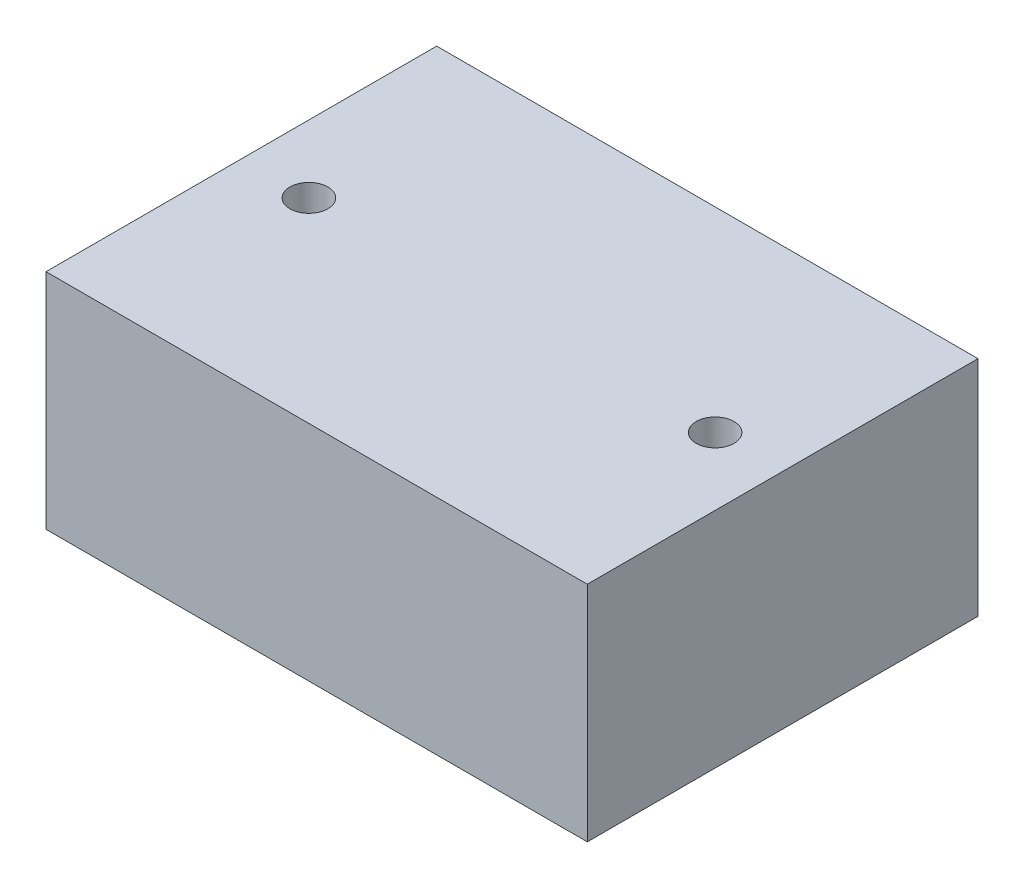
ISO-10303-21;
HEADER;
FILE_DESCRIPTION(('STEP AP214'),'2;1');
FILE_NAME('part.step','',(''),(''),'','','');
FILE_SCHEMA(('AUTOMOTIVE_DESIGN { 1 0 10303 214 1 1 1 1 }'));
ENDSEC;
DATA;
#1=APPLICATION_CONTEXT('core data for automotive mechanical design processes');
#2=APPLICATION_PROTOCOL_DEFINITION('international standard','automotive_design',2000,#1);
#3=PRODUCT_CONTEXT('',#1,'mechanical');
#4=PRODUCT('Part','Part','',(#3));
#5=PRODUCT_RELATED_PRODUCT_CATEGORY('part','',(#4));
#6=PRODUCT_DEFINITION_FORMATION('','',#4);
#7=PRODUCT_DEFINITION_CONTEXT('part definition',#1,'design');
#8=PRODUCT_DEFINITION('design','',#6,#7);
#9=PRODUCT_DEFINITION_SHAPE('','',#8);
#10=(LENGTH_UNIT() NAMED_UNIT(*) SI_UNIT(.MILLI.,.METRE.));
#11=(NAMED_UNIT(*) PLANE_ANGLE_UNIT() SI_UNIT($,.RADIAN.));
#12=(NAMED_UNIT(*) SI_UNIT($,.STERADIAN.) SOLID_ANGLE_UNIT());
#13=UNCERTAINTY_MEASURE_WITH_UNIT(LENGTH_MEASURE(1.E-05),#10,'distance_accuracy_value','');
#14=(GEOMETRIC_REPRESENTATION_CONTEXT(3) GLOBAL_UNCERTAINTY_ASSIGNED_CONTEXT((#13)) GLOBAL_UNIT_ASSIGNED_CONTEXT((#10,
#11,#12)) REPRESENTATION_CONTEXT('',''));
#15=CARTESIAN_POINT('',(0.,0.,0.));
#16=DIRECTION('',(0.,0.,1.));
#17=DIRECTION('',(1.,0.,0.));
#18=AXIS2_PLACEMENT_3D('',#15,#16,#17);
#19=CARTESIAN_POINT('',(31.425,25.91,22.68));
#20=DIRECTION('',(-1.,0.,0.));
#21=DIRECTION('',(0.,0.,1.));
#22=AXIS2_PLACEMENT_3D('',#19,#20,#21);
#23=PLANE('',#22);
#24=DIRECTION('',(0.,0.,-1.));
#25=VECTOR('',#24,1.);
#26=CARTESIAN_POINT('',(31.425,0.,22.68));
#27=LINE('',#26,#25);
#28=CARTESIAN_POINT('',(31.425,0.,22.68));
#29=VERTEX_POINT('',#28);
#30=CARTESIAN_POINT('',(31.425,0.,-22.68));
#31=VERTEX_POINT('',#30);
#32=EDGE_CURVE('E95',#29,#31,#27,.T.);
#33=ORIENTED_EDGE('',*,*,#32,.T.);
#34=DIRECTION('',(0.,-1.,0.));
#35=VECTOR('',#34,1.);
#36=CARTESIAN_POINT('',(31.425,25.91,-22.68));
#37=LINE('',#36,#35);
#38=CARTESIAN_POINT('',(31.425,25.91,-22.68));
#39=VERTEX_POINT('',#38);
#40=EDGE_CURVE('E11',#39,#31,#37,.T.);
#41=ORIENTED_EDGE('',*,*,#40,.F.);
#42=DIRECTION('',(0.,0.,-1.));
#43=VECTOR('',#42,1.);
#44=CARTESIAN_POINT('',(31.425,25.91,22.68));
#45=LINE('',#44,#43);
#46=CARTESIAN_POINT('',(31.425,25.91,22.68));
#47=VERTEX_POINT('',#46);
#48=EDGE_CURVE('E83',#47,#39,#45,.T.);
#49=ORIENTED_EDGE('',*,*,#48,.F.);
#50=DIRECTION('',(0.,-1.,0.));
#51=VECTOR('',#50,1.);
#52=CARTESIAN_POINT('',(31.425,25.91,22.68));
#53=LINE('',#52,#51);
#54=EDGE_CURVE('E91',#47,#29,#53,.T.);
#55=ORIENTED_EDGE('',*,*,#54,.T.);
#56=EDGE_LOOP('',(#33,#41,#49,#55));
#57=FACE_BOUND('',#56,.T.);
#58=ADVANCED_FACE('F32',(#57),#23,.F.);
#59=CARTESIAN_POINT('',(-31.425,25.91,-22.68));
#60=DIRECTION('',(0.,0.,1.));
#61=DIRECTION('',(1.,0.,0.));
#62=AXIS2_PLACEMENT_3D('',#59,#60,#61);
#63=PLANE('',#62);
#64=DIRECTION('',(-1.,0.,0.));
#65=VECTOR('',#64,1.);
#66=CARTESIAN_POINT('',(-31.425,0.,-22.68));
#67=LINE('',#66,#65);
#68=CARTESIAN_POINT('',(-31.425,0.,-22.68));
#69=VERTEX_POINT('',#68);
#70=EDGE_CURVE('E87',#31,#69,#67,.T.);
#71=ORIENTED_EDGE('',*,*,#70,.T.);
#72=DIRECTION('',(0.,-1.,0.));
#73=VECTOR('',#72,1.);
#74=CARTESIAN_POINT('',(-31.425,25.91,-22.68));
#75=LINE('',#74,#73);
#76=CARTESIAN_POINT('',(-31.425,25.91,-22.68));
#77=VERTEX_POINT('',#76);
#78=EDGE_CURVE('E40',#77,#69,#75,.T.);
#79=ORIENTED_EDGE('',*,*,#78,.F.);
#80=DIRECTION('',(-1.,0.,0.));
#81=VECTOR('',#80,1.);
#82=CARTESIAN_POINT('',(-31.425,25.91,-22.68));
#83=LINE('',#82,#81);
#84=EDGE_CURVE('E78',#39,#77,#83,.T.);
#85=ORIENTED_EDGE('',*,*,#84,.F.);
#86=ORIENTED_EDGE('',*,*,#40,.T.);
#87=EDGE_LOOP('',(#71,#79,#85,#86));
#88=FACE_BOUND('',#87,.T.);
#89=ADVANCED_FACE('F86',(#88),#63,.F.);
#90=CARTESIAN_POINT('',(-31.425,25.91,22.68));
#91=DIRECTION('',(1.,0.,0.));
#92=DIRECTION('',(0.,0.,-1.));
#93=AXIS2_PLACEMENT_3D('',#90,#91,#92);
#94=PLANE('',#93);
#95=DIRECTION('',(0.,0.,1.));
#96=VECTOR('',#95,1.);
#97=CARTESIAN_POINT('',(-31.425,0.,22.68));
#98=LINE('',#97,#96);
#99=CARTESIAN_POINT('',(-31.425,0.,22.68));
#100=VERTEX_POINT('',#99);
#101=EDGE_CURVE('E65',#69,#100,#98,.T.);
#102=ORIENTED_EDGE('',*,*,#101,.T.);
#103=DIRECTION('',(0.,-1.,0.));
#104=VECTOR('',#103,1.);
#105=CARTESIAN_POINT('',(-31.425,25.91,22.68));
#106=LINE('',#105,#104);
#107=CARTESIAN_POINT('',(-31.425,25.91,22.68));
#108=VERTEX_POINT('',#107);
#109=EDGE_CURVE('E88',#108,#100,#106,.T.);
#110=ORIENTED_EDGE('',*,*,#109,.F.);
#111=DIRECTION('',(0.,0.,1.));
#112=VECTOR('',#111,1.);
#113=CARTESIAN_POINT('',(-31.425,25.91,22.68));
#114=LINE('',#113,#112);
#115=EDGE_CURVE('E81',#77,#108,#114,.T.);
#116=ORIENTED_EDGE('',*,*,#115,.F.);
#117=ORIENTED_EDGE('',*,*,#78,.T.);
#118=EDGE_LOOP('',(#102,#110,#116,#117));
#119=FACE_BOUND('',#118,.T.);
#120=ADVANCED_FACE('F89',(#119),#94,.F.);
#121=CARTESIAN_POINT('',(-31.425,25.91,22.68));
#122=DIRECTION('',(0.,0.,-1.));
#123=DIRECTION('',(-1.,0.,0.));
#124=AXIS2_PLACEMENT_3D('',#121,#122,#123);
#125=PLANE('',#124);
#126=DIRECTION('',(1.,0.,0.));
#127=VECTOR('',#126,1.);
#128=CARTESIAN_POINT('',(-31.425,0.,22.68));
#129=LINE('',#128,#127);
#130=EDGE_CURVE('E71',#100,#29,#129,.T.);
#131=ORIENTED_EDGE('',*,*,#130,.T.);
#132=ORIENTED_EDGE('',*,*,#54,.F.);
#133=DIRECTION('',(1.,0.,0.));
#134=VECTOR('',#133,1.);
#135=CARTESIAN_POINT('',(-31.425,25.91,22.68));
#136=LINE('',#135,#134);
#137=EDGE_CURVE('E48',#108,#47,#136,.T.);
#138=ORIENTED_EDGE('',*,*,#137,.F.);
#139=ORIENTED_EDGE('',*,*,#109,.T.);
#140=EDGE_LOOP('',(#131,#132,#138,#139));
#141=FACE_BOUND('',#140,.T.);
#142=ADVANCED_FACE('F103',(#141),#125,.F.);
#143=CARTESIAN_POINT('',(0.,25.91,0.));
#144=DIRECTION('',(0.,-1.,0.));
#145=DIRECTION('',(0.,0.,-1.));
#146=AXIS2_PLACEMENT_3D('',#143,#144,#145);
#147=PLANE('',#146);
#148=CARTESIAN_POINT('',(-23.585,25.91,0.));
#149=DIRECTION('',(0.,1.,0.));
#150=DIRECTION('',(0.,0.,-1.));
#151=AXIS2_PLACEMENT_3D('',#148,#149,#150);
#152=CIRCLE('',#151,2.2);
#153=CARTESIAN_POINT('',(-23.585,25.91,-2.2));
#154=VERTEX_POINT('',#153);
#155=EDGE_CURVE('E112',#154,#154,#152,.T.);
#156=ORIENTED_EDGE('',*,*,#155,.F.);
#157=EDGE_LOOP('',(#156));
#158=FACE_BOUND('',#157,.T.);
#159=CARTESIAN_POINT('',(23.585,25.91,0.));
#160=DIRECTION('',(0.,-1.,0.));
#161=DIRECTION('',(0.,0.,-1.));
#162=AXIS2_PLACEMENT_3D('',#159,#160,#161);
#163=CIRCLE('',#162,2.2);
#164=CARTESIAN_POINT('',(23.585,25.91,-2.2));
#165=VERTEX_POINT('',#164);
#166=EDGE_CURVE('E98',#165,#165,#163,.T.);
#167=ORIENTED_EDGE('',*,*,#166,.T.);
#168=EDGE_LOOP('',(#167));
#169=FACE_BOUND('',#168,.T.);
#170=ORIENTED_EDGE('',*,*,#48,.T.);
#171=ORIENTED_EDGE('',*,*,#84,.T.);
#172=ORIENTED_EDGE('',*,*,#115,.T.);
#173=ORIENTED_EDGE('',*,*,#137,.T.);
#174=EDGE_LOOP('',(#170,#171,#172,#173));
#175=FACE_BOUND('',#174,.T.);
#176=ADVANCED_FACE('F79',(#158,#169,#175),#147,.F.);
#177=CARTESIAN_POINT('',(0.,0.,0.));
#178=DIRECTION('',(0.,-1.,0.));
#179=DIRECTION('',(0.,0.,-1.));
#180=AXIS2_PLACEMENT_3D('',#177,#178,#179);
#181=PLANE('',#180);
#182=CARTESIAN_POINT('',(-23.585,0.,0.));
#183=DIRECTION('',(0.,1.,0.));
#184=DIRECTION('',(0.,0.,-1.));
#185=AXIS2_PLACEMENT_3D('',#182,#183,#184);
#186=CIRCLE('',#185,2.2);
#187=CARTESIAN_POINT('',(-23.585,0.,-2.2));
#188=VERTEX_POINT('',#187);
#189=EDGE_CURVE('E115',#188,#188,#186,.T.);
#190=ORIENTED_EDGE('',*,*,#189,.T.);
#191=EDGE_LOOP('',(#190));
#192=FACE_BOUND('',#191,.T.);
#193=CARTESIAN_POINT('',(23.585,0.,0.));
#194=DIRECTION('',(0.,-1.,0.));
#195=DIRECTION('',(0.,0.,-1.));
#196=AXIS2_PLACEMENT_3D('',#193,#194,#195);
#197=CIRCLE('',#196,2.2);
#198=CARTESIAN_POINT('',(23.585,0.,-2.2));
#199=VERTEX_POINT('',#198);
#200=EDGE_CURVE('E109',#199,#199,#197,.T.);
#201=ORIENTED_EDGE('',*,*,#200,.F.);
#202=EDGE_LOOP('',(#201));
#203=FACE_BOUND('',#202,.T.);
#204=ORIENTED_EDGE('',*,*,#32,.F.);
#205=ORIENTED_EDGE('',*,*,#130,.F.);
#206=ORIENTED_EDGE('',*,*,#101,.F.);
#207=ORIENTED_EDGE('',*,*,#70,.F.);
#208=EDGE_LOOP('',(#204,#205,#206,#207));
#209=FACE_BOUND('',#208,.T.);
#210=ADVANCED_FACE('F106',(#192,#203,#209),#181,.T.);
#211=CARTESIAN_POINT('',(23.585,25.91,0.));
#212=DIRECTION('',(0.,-1.,0.));
#213=DIRECTION('',(0.,0.,-1.));
#214=AXIS2_PLACEMENT_3D('',#211,#212,#213);
#215=CYLINDRICAL_SURFACE('',#214,2.2);
#216=CARTESIAN_POINT('',(23.585,25.91,-2.2));
#217=CARTESIAN_POINT('',(23.585,25.6401041666667,-2.2));
#218=CARTESIAN_POINT('',(23.585,25.3702083333333,-2.2));
#219=CARTESIAN_POINT('',(23.585,24.8304166666667,-2.2));
#220=CARTESIAN_POINT('',(23.585,24.5605208333333,-2.2));
#221=CARTESIAN_POINT('',(23.585,24.0207291666667,-2.2));
#222=CARTESIAN_POINT('',(23.585,23.7508333333333,-2.2));
#223=CARTESIAN_POINT('',(23.585,23.2110416666667,-2.2));
#224=CARTESIAN_POINT('',(23.585,22.9411458333333,-2.2));
#225=CARTESIAN_POINT('',(23.585,22.4013541666667,-2.2));
#226=CARTESIAN_POINT('',(23.585,22.1314583333333,-2.2));
#227=CARTESIAN_POINT('',(23.585,21.5916666666667,-2.2));
#228=CARTESIAN_POINT('',(23.585,21.3217708333333,-2.2));
#229=CARTESIAN_POINT('',(23.585,20.7819791666667,-2.2));
#230=CARTESIAN_POINT('',(23.585,20.5120833333333,-2.2));
#231=CARTESIAN_POINT('',(23.585,19.9722916666667,-2.2));
#232=CARTESIAN_POINT('',(23.585,19.7023958333333,-2.2));
#233=CARTESIAN_POINT('',(23.585,19.1626041666667,-2.2));
#234=CARTESIAN_POINT('',(23.585,18.8927083333333,-2.2));
#235=CARTESIAN_POINT('',(23.585,18.3529166666667,-2.2));
#236=CARTESIAN_POINT('',(23.585,18.0830208333333,-2.2));
#237=CARTESIAN_POINT('',(23.585,17.5432291666667,-2.2));
#238=CARTESIAN_POINT('',(23.585,17.2733333333333,-2.2));
#239=CARTESIAN_POINT('',(23.585,16.7335416666667,-2.2));
#240=CARTESIAN_POINT('',(23.585,16.4636458333333,-2.2));
#241=CARTESIAN_POINT('',(23.585,15.9238541666667,-2.2));
#242=CARTESIAN_POINT('',(23.585,15.6539583333333,-2.2));
#243=CARTESIAN_POINT('',(23.585,15.1141666666667,-2.2));
#244=CARTESIAN_POINT('',(23.585,14.8442708333333,-2.2));
#245=CARTESIAN_POINT('',(23.585,14.3044791666667,-2.2));
#246=CARTESIAN_POINT('',(23.585,14.0345833333333,-2.2));
#247=CARTESIAN_POINT('',(23.585,13.4947916666667,-2.2));
#248=CARTESIAN_POINT('',(23.585,13.2248958333333,-2.2));
#249=CARTESIAN_POINT('',(23.585,12.6851041666667,-2.2));
#250=CARTESIAN_POINT('',(23.585,12.4152083333333,-2.2));
#251=CARTESIAN_POINT('',(23.585,11.8754166666667,-2.2));
#252=CARTESIAN_POINT('',(23.585,11.6055208333333,-2.2));
#253=CARTESIAN_POINT('',(23.585,11.0657291666667,-2.2));
#254=CARTESIAN_POINT('',(23.585,10.7958333333333,-2.2));
#255=CARTESIAN_POINT('',(23.585,10.2560416666667,-2.2));
#256=CARTESIAN_POINT('',(23.585,9.98614583333334,-2.2));
#257=CARTESIAN_POINT('',(23.585,9.44635416666667,-2.2));
#258=CARTESIAN_POINT('',(23.585,9.17645833333333,-2.2));
#259=CARTESIAN_POINT('',(23.585,8.63666666666666,-2.2));
#260=CARTESIAN_POINT('',(23.585,8.36677083333333,-2.2));
#261=CARTESIAN_POINT('',(23.585,7.82697916666667,-2.2));
#262=CARTESIAN_POINT('',(23.585,7.55708333333333,-2.2));
#263=CARTESIAN_POINT('',(23.585,7.01729166666667,-2.2));
#264=CARTESIAN_POINT('',(23.585,6.74739583333333,-2.2));
#265=CARTESIAN_POINT('',(23.585,6.20760416666667,-2.2));
#266=CARTESIAN_POINT('',(23.585,5.93770833333333,-2.2));
#267=CARTESIAN_POINT('',(23.585,5.39791666666667,-2.2));
#268=CARTESIAN_POINT('',(23.585,5.12802083333333,-2.2));
#269=CARTESIAN_POINT('',(23.585,4.58822916666667,-2.2));
#270=CARTESIAN_POINT('',(23.585,4.31833333333333,-2.2));
#271=CARTESIAN_POINT('',(23.585,3.77854166666667,-2.2));
#272=CARTESIAN_POINT('',(23.585,3.50864583333333,-2.2));
#273=CARTESIAN_POINT('',(23.585,2.96885416666667,-2.2));
#274=CARTESIAN_POINT('',(23.585,2.69895833333333,-2.2));
#275=CARTESIAN_POINT('',(23.585,2.15916666666667,-2.2));
#276=CARTESIAN_POINT('',(23.585,1.88927083333333,-2.2));
#277=CARTESIAN_POINT('',(23.585,1.34947916666667,-2.2));
#278=CARTESIAN_POINT('',(23.585,1.07958333333333,-2.2));
#279=CARTESIAN_POINT('',(23.585,0.539791666666666,-2.2));
#280=CARTESIAN_POINT('',(23.585,0.269895833333333,-2.2));
#281=CARTESIAN_POINT('',(23.585,0.,-2.2));
#282=B_SPLINE_CURVE_WITH_KNOTS('',3,(#216,#217,#218,#219,#220,#221,#222,#223,#224,#225,#226,
#227,#228,#229,#230,#231,#232,#233,#234,#235,#236,#237,#238,#239,#240,#241,#242,#243,#244,#245,
#246,#247,#248,#249,#250,#251,#252,#253,#254,#255,#256,#257,#258,#259,#260,#261,#262,#263,#264,
#265,#266,#267,#268,#269,#270,#271,#272,#273,#274,#275,#276,#277,#278,#279,#280,#281),
.UNSPECIFIED.,.F.,.F.,(4,2,2,2,2,2,2,2,2,2,2,2,2,2,2,2,2,2,2,2,2,2,2,2,2,2,2,2,2,2,2,2,4),(0.,
0.8096875,1.619375,2.4290625,3.23875,4.0484375,4.858125,5.6678125,6.4775,7.2871875,8.096875,
8.9065625,9.71625,10.5259375,11.335625,12.1453125,12.955,13.7646875,14.574375,15.3840625,
16.19375,17.0034375,17.813125,18.6228125,19.4325,20.2421875,21.051875,21.8615625,22.67125,
23.4809375,24.290625,25.1003125,25.91),.UNSPECIFIED.);
#283=EDGE_CURVE('BSEAM129',#165,#199,#282,.T.);
#284=ORIENTED_EDGE('',*,*,#166,.F.);
#285=ORIENTED_EDGE('',*,*,#200,.T.);
#286=ORIENTED_EDGE('',*,*,#283,.T.);
#287=ORIENTED_EDGE('',*,*,#283,.F.);
#288=EDGE_LOOP('',(#284,#286,#285,#287));
#289=FACE_BOUND('',#288,.T.);
#290=ADVANCED_FACE('F129',(#289),#215,.F.);
#291=CARTESIAN_POINT('',(-23.585,25.91,0.));
#292=DIRECTION('',(0.,-1.,0.));
#293=DIRECTION('',(0.,0.,-1.));
#294=AXIS2_PLACEMENT_3D('',#291,#292,#293);
#295=CYLINDRICAL_SURFACE('',#294,2.2);
#296=CARTESIAN_POINT('',(-23.585,25.91,-2.2));
#297=CARTESIAN_POINT('',(-23.585,25.6401041666667,-2.2));
#298=CARTESIAN_POINT('',(-23.585,25.3702083333333,-2.2));
#299=CARTESIAN_POINT('',(-23.585,24.8304166666667,-2.2));
#300=CARTESIAN_POINT('',(-23.585,24.5605208333333,-2.2));
#301=CARTESIAN_POINT('',(-23.585,24.0207291666667,-2.2));
#302=CARTESIAN_POINT('',(-23.585,23.7508333333333,-2.2));
#303=CARTESIAN_POINT('',(-23.585,23.2110416666667,-2.2));
#304=CARTESIAN_POINT('',(-23.585,22.9411458333333,-2.2));
#305=CARTESIAN_POINT('',(-23.585,22.4013541666667,-2.2));
#306=CARTESIAN_POINT('',(-23.585,22.1314583333333,-2.2));
#307=CARTESIAN_POINT('',(-23.585,21.5916666666667,-2.2));
#308=CARTESIAN_POINT('',(-23.585,21.3217708333333,-2.2));
#309=CARTESIAN_POINT('',(-23.585,20.7819791666667,-2.2));
#310=CARTESIAN_POINT('',(-23.585,20.5120833333333,-2.2));
#311=CARTESIAN_POINT('',(-23.585,19.9722916666667,-2.2));
#312=CARTESIAN_POINT('',(-23.585,19.7023958333333,-2.2));
#313=CARTESIAN_POINT('',(-23.585,19.1626041666667,-2.2));
#314=CARTESIAN_POINT('',(-23.585,18.8927083333333,-2.2));
#315=CARTESIAN_POINT('',(-23.585,18.3529166666667,-2.2));
#316=CARTESIAN_POINT('',(-23.585,18.0830208333333,-2.2));
#317=CARTESIAN_POINT('',(-23.585,17.5432291666667,-2.2));
#318=CARTESIAN_POINT('',(-23.585,17.2733333333333,-2.2));
#319=CARTESIAN_POINT('',(-23.585,16.7335416666667,-2.2));
#320=CARTESIAN_POINT('',(-23.585,16.4636458333333,-2.2));
#321=CARTESIAN_POINT('',(-23.585,15.9238541666667,-2.2));
#322=CARTESIAN_POINT('',(-23.585,15.6539583333333,-2.2));
#323=CARTESIAN_POINT('',(-23.585,15.1141666666667,-2.2));
#324=CARTESIAN_POINT('',(-23.585,14.8442708333333,-2.2));
#325=CARTESIAN_POINT('',(-23.585,14.3044791666667,-2.2));
#326=CARTESIAN_POINT('',(-23.585,14.0345833333333,-2.2));
#327=CARTESIAN_POINT('',(-23.585,13.4947916666667,-2.2));
#328=CARTESIAN_POINT('',(-23.585,13.2248958333333,-2.2));
#329=CARTESIAN_POINT('',(-23.585,12.6851041666667,-2.2));
#330=CARTESIAN_POINT('',(-23.585,12.4152083333333,-2.2));
#331=CARTESIAN_POINT('',(-23.585,11.8754166666667,-2.2));
#332=CARTESIAN_POINT('',(-23.585,11.6055208333333,-2.2));
#333=CARTESIAN_POINT('',(-23.585,11.0657291666667,-2.2));
#334=CARTESIAN_POINT('',(-23.585,10.7958333333333,-2.2));
#335=CARTESIAN_POINT('',(-23.585,10.2560416666667,-2.2));
#336=CARTESIAN_POINT('',(-23.585,9.98614583333333,-2.2));
#337=CARTESIAN_POINT('',(-23.585,9.44635416666667,-2.2));
#338=CARTESIAN_POINT('',(-23.585,9.17645833333333,-2.2));
#339=CARTESIAN_POINT('',(-23.585,8.63666666666666,-2.2));
#340=CARTESIAN_POINT('',(-23.585,8.36677083333333,-2.2));
#341=CARTESIAN_POINT('',(-23.585,7.82697916666667,-2.2));
#342=CARTESIAN_POINT('',(-23.585,7.55708333333333,-2.2));
#343=CARTESIAN_POINT('',(-23.585,7.01729166666667,-2.2));
#344=CARTESIAN_POINT('',(-23.585,6.74739583333333,-2.2));
#345=CARTESIAN_POINT('',(-23.585,6.20760416666667,-2.2));
#346=CARTESIAN_POINT('',(-23.585,5.93770833333333,-2.2));
#347=CARTESIAN_POINT('',(-23.585,5.39791666666667,-2.2));
#348=CARTESIAN_POINT('',(-23.585,5.12802083333333,-2.2));
#349=CARTESIAN_POINT('',(-23.585,4.58822916666667,-2.2));
#350=CARTESIAN_POINT('',(-23.585,4.31833333333333,-2.2));
#351=CARTESIAN_POINT('',(-23.585,3.77854166666666,-2.2));
#352=CARTESIAN_POINT('',(-23.585,3.50864583333333,-2.2));
#353=CARTESIAN_POINT('',(-23.585,2.96885416666667,-2.2));
#354=CARTESIAN_POINT('',(-23.585,2.69895833333333,-2.2));
#355=CARTESIAN_POINT('',(-23.585,2.15916666666667,-2.2));
#356=CARTESIAN_POINT('',(-23.585,1.88927083333333,-2.2));
#357=CARTESIAN_POINT('',(-23.585,1.34947916666667,-2.2));
#358=CARTESIAN_POINT('',(-23.585,1.07958333333333,-2.2));
#359=CARTESIAN_POINT('',(-23.585,0.539791666666667,-2.2));
#360=CARTESIAN_POINT('',(-23.585,0.269895833333334,-2.2));
#361=CARTESIAN_POINT('',(-23.585,0.,-2.2));
#362=B_SPLINE_CURVE_WITH_KNOTS('',3,(#296,#297,#298,#299,#300,#301,#302,#303,#304,#305,#306,
#307,#308,#309,#310,#311,#312,#313,#314,#315,#316,#317,#318,#319,#320,#321,#322,#323,#324,#325,
#326,#327,#328,#329,#330,#331,#332,#333,#334,#335,#336,#337,#338,#339,#340,#341,#342,#343,#344,
#345,#346,#347,#348,#349,#350,#351,#352,#353,#354,#355,#356,#357,#358,#359,#360,#361),
.UNSPECIFIED.,.F.,.F.,(4,2,2,2,2,2,2,2,2,2,2,2,2,2,2,2,2,2,2,2,2,2,2,2,2,2,2,2,2,2,2,2,4),(0.,
0.8096875,1.619375,2.4290625,3.23875,4.0484375,4.858125,5.6678125,6.4775,7.2871875,8.096875,
8.9065625,9.71625,10.5259375,11.335625,12.1453125,12.955,13.7646875,14.574375,15.3840625,
16.19375,17.0034375,17.813125,18.6228125,19.4325,20.2421875,21.051875,21.8615625,22.67125,
23.4809375,24.290625,25.1003125,25.91),.UNSPECIFIED.);
#363=EDGE_CURVE('BSEAM121',#154,#188,#362,.T.);
#364=ORIENTED_EDGE('',*,*,#155,.T.);
#365=ORIENTED_EDGE('',*,*,#189,.F.);
#366=ORIENTED_EDGE('',*,*,#363,.T.);
#367=ORIENTED_EDGE('',*,*,#363,.F.);
#368=EDGE_LOOP('',(#364,#366,#365,#367));
#369=FACE_BOUND('',#368,.T.);
#370=ADVANCED_FACE('F121',(#369),#295,.F.);
#371=CLOSED_SHELL('',(#58,#89,#120,#142,#176,#210,#290,#370));
#372=MANIFOLD_SOLID_BREP('B2',#371);
#373=ADVANCED_BREP_SHAPE_REPRESENTATION('',(#18,#372),#14);
#374=SHAPE_DEFINITION_REPRESENTATION(#9,#373);
ENDSEC;
END-ISO-10303-21;
